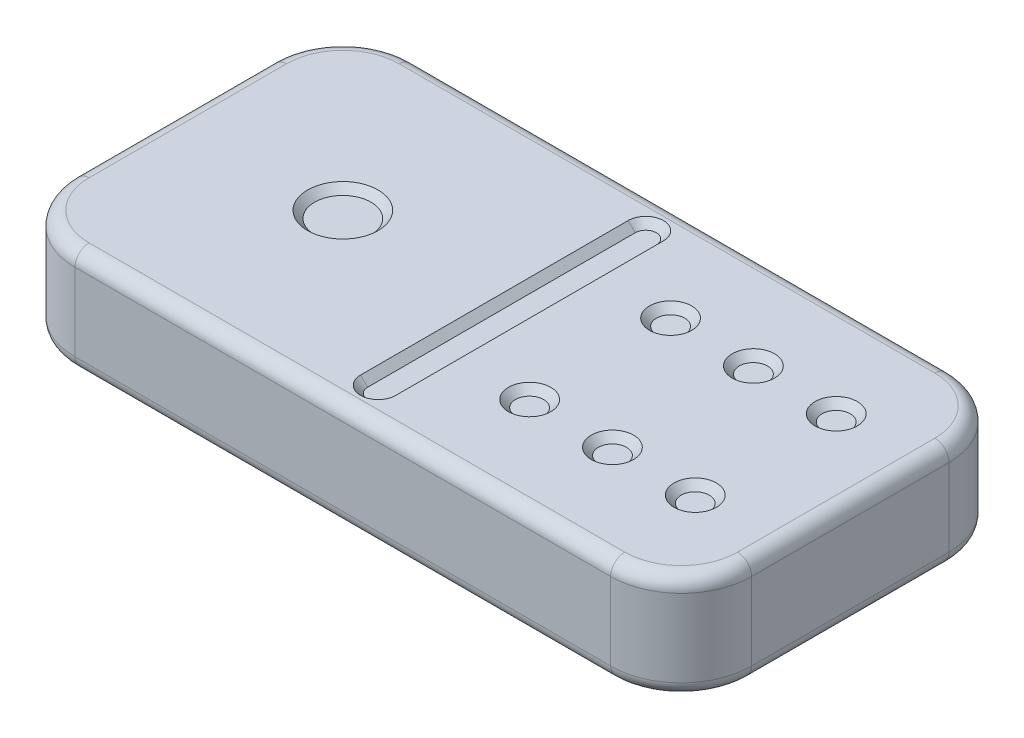
ISO-10303-21;
HEADER;
FILE_DESCRIPTION(('STEP AP214'),'2;1');
FILE_NAME('part.step','',(''),(''),'','','');
FILE_SCHEMA(('AUTOMOTIVE_DESIGN { 1 0 10303 214 1 1 1 1 }'));
ENDSEC;
DATA;
#1=APPLICATION_CONTEXT('core data for automotive mechanical design processes');
#2=APPLICATION_PROTOCOL_DEFINITION('international standard','automotive_design',2000,#1);
#3=PRODUCT_CONTEXT('',#1,'mechanical');
#4=PRODUCT('Part','Part','',(#3));
#5=PRODUCT_RELATED_PRODUCT_CATEGORY('part','',(#4));
#6=PRODUCT_DEFINITION_FORMATION('','',#4);
#7=PRODUCT_DEFINITION_CONTEXT('part definition',#1,'design');
#8=PRODUCT_DEFINITION('design','',#6,#7);
#9=PRODUCT_DEFINITION_SHAPE('','',#8);
#10=(LENGTH_UNIT() NAMED_UNIT(*) SI_UNIT(.MILLI.,.METRE.));
#11=(NAMED_UNIT(*) PLANE_ANGLE_UNIT() SI_UNIT($,.RADIAN.));
#12=(NAMED_UNIT(*) SI_UNIT($,.STERADIAN.) SOLID_ANGLE_UNIT());
#13=UNCERTAINTY_MEASURE_WITH_UNIT(LENGTH_MEASURE(1.E-05),#10,'distance_accuracy_value','');
#14=(GEOMETRIC_REPRESENTATION_CONTEXT(3) GLOBAL_UNCERTAINTY_ASSIGNED_CONTEXT((#13)) GLOBAL_UNIT_ASSIGNED_CONTEXT((#10,
#11,#12)) REPRESENTATION_CONTEXT('',''));
#15=CARTESIAN_POINT('',(0.,0.,0.));
#16=DIRECTION('',(0.,0.,1.));
#17=DIRECTION('',(1.,0.,0.));
#18=AXIS2_PLACEMENT_3D('',#15,#16,#17);
#19=CARTESIAN_POINT('',(0.,7.5,0.));
#20=DIRECTION('',(1.,0.,0.));
#21=DIRECTION('',(0.,0.,-1.));
#22=AXIS2_PLACEMENT_3D('',#19,#20,#21);
#23=PLANE('',#22);
#24=DIRECTION('',(0.,-1.,0.));
#25=VECTOR('',#24,1.);
#26=CARTESIAN_POINT('',(0.,7.5,-19.));
#27=LINE('',#26,#25);
#28=CARTESIAN_POINT('',(0.,6.5,-19.));
#29=VERTEX_POINT('',#28);
#30=CARTESIAN_POINT('',(0.,1.,-19.));
#31=VERTEX_POINT('',#30);
#32=EDGE_CURVE('E882',#29,#31,#27,.T.);
#33=ORIENTED_EDGE('',*,*,#32,.T.);
#34=DIRECTION('',(0.,0.,1.));
#35=VECTOR('',#34,1.);
#36=CARTESIAN_POINT('',(0.,1.,-5.));
#37=LINE('',#36,#35);
#38=CARTESIAN_POINT('',(0.,1.,-5.));
#39=VERTEX_POINT('',#38);
#40=EDGE_CURVE('E300',#31,#39,#37,.T.);
#41=ORIENTED_EDGE('',*,*,#40,.T.);
#42=DIRECTION('',(0.,-1.,0.));
#43=VECTOR('',#42,1.);
#44=CARTESIAN_POINT('',(0.,7.5,-5.));
#45=LINE('',#44,#43);
#46=CARTESIAN_POINT('',(0.,6.5,-5.));
#47=VERTEX_POINT('',#46);
#48=EDGE_CURVE('E195',#39,#47,#45,.F.);
#49=ORIENTED_EDGE('',*,*,#48,.T.);
#50=DIRECTION('',(0.,0.,1.));
#51=VECTOR('',#50,1.);
#52=CARTESIAN_POINT('',(0.,6.5,0.));
#53=LINE('',#52,#51);
#54=EDGE_CURVE('E224',#47,#29,#53,.F.);
#55=ORIENTED_EDGE('',*,*,#54,.T.);
#56=EDGE_LOOP('',(#33,#41,#49,#55));
#57=FACE_BOUND('',#56,.T.);
#58=ADVANCED_FACE('F37',(#57),#23,.F.);
#59=CARTESIAN_POINT('',(0.,7.5,0.));
#60=DIRECTION('',(0.,0.,-1.));
#61=DIRECTION('',(-1.,0.,0.));
#62=AXIS2_PLACEMENT_3D('',#59,#60,#61);
#63=PLANE('',#62);
#64=DIRECTION('',(0.,-1.,0.));
#65=VECTOR('',#64,1.);
#66=CARTESIAN_POINT('',(5.,7.5,0.));
#67=LINE('',#66,#65);
#68=CARTESIAN_POINT('',(5.,6.5,0.));
#69=VERTEX_POINT('',#68);
#70=CARTESIAN_POINT('',(5.,1.,0.));
#71=VERTEX_POINT('',#70);
#72=EDGE_CURVE('E868',#69,#71,#67,.T.);
#73=ORIENTED_EDGE('',*,*,#72,.T.);
#74=DIRECTION('',(1.,0.,0.));
#75=VECTOR('',#74,1.);
#76=CARTESIAN_POINT('',(43.,1.,0.));
#77=LINE('',#76,#75);
#78=CARTESIAN_POINT('',(43.,1.,0.));
#79=VERTEX_POINT('',#78);
#80=EDGE_CURVE('E294',#71,#79,#77,.T.);
#81=ORIENTED_EDGE('',*,*,#80,.T.);
#82=DIRECTION('',(0.,-1.,0.));
#83=VECTOR('',#82,1.);
#84=CARTESIAN_POINT('',(43.,7.5,0.));
#85=LINE('',#84,#83);
#86=CARTESIAN_POINT('',(43.,6.5,0.));
#87=VERTEX_POINT('',#86);
#88=EDGE_CURVE('E872',#79,#87,#85,.F.);
#89=ORIENTED_EDGE('',*,*,#88,.T.);
#90=DIRECTION('',(1.,0.,0.));
#91=VECTOR('',#90,1.);
#92=CARTESIAN_POINT('',(0.,6.5,0.));
#93=LINE('',#92,#91);
#94=EDGE_CURVE('E217',#87,#69,#93,.F.);
#95=ORIENTED_EDGE('',*,*,#94,.T.);
#96=EDGE_LOOP('',(#73,#81,#89,#95));
#97=FACE_BOUND('',#96,.T.);
#98=ADVANCED_FACE('F403',(#97),#63,.F.);
#99=CARTESIAN_POINT('',(48.,7.5,0.));
#100=DIRECTION('',(-1.,0.,0.));
#101=DIRECTION('',(0.,0.,1.));
#102=AXIS2_PLACEMENT_3D('',#99,#100,#101);
#103=PLANE('',#102);
#104=DIRECTION('',(0.,-1.,0.));
#105=VECTOR('',#104,1.);
#106=CARTESIAN_POINT('',(48.,7.5,-5.));
#107=LINE('',#106,#105);
#108=CARTESIAN_POINT('',(48.,6.5,-5.));
#109=VERTEX_POINT('',#108);
#110=CARTESIAN_POINT('',(48.,1.,-5.));
#111=VERTEX_POINT('',#110);
#112=EDGE_CURVE('E865',#109,#111,#107,.T.);
#113=ORIENTED_EDGE('',*,*,#112,.T.);
#114=DIRECTION('',(0.,0.,-1.));
#115=VECTOR('',#114,1.);
#116=CARTESIAN_POINT('',(48.,1.,-19.));
#117=LINE('',#116,#115);
#118=CARTESIAN_POINT('',(48.,1.,-19.));
#119=VERTEX_POINT('',#118);
#120=EDGE_CURVE('E288',#111,#119,#117,.T.);
#121=ORIENTED_EDGE('',*,*,#120,.T.);
#122=DIRECTION('',(0.,-1.,0.));
#123=VECTOR('',#122,1.);
#124=CARTESIAN_POINT('',(48.,7.5,-19.));
#125=LINE('',#124,#123);
#126=CARTESIAN_POINT('',(48.,6.5,-19.));
#127=VERTEX_POINT('',#126);
#128=EDGE_CURVE('E259',#119,#127,#125,.F.);
#129=ORIENTED_EDGE('',*,*,#128,.T.);
#130=DIRECTION('',(0.,0.,-1.));
#131=VECTOR('',#130,1.);
#132=CARTESIAN_POINT('',(48.,6.5,0.));
#133=LINE('',#132,#131);
#134=EDGE_CURVE('E205',#127,#109,#133,.F.);
#135=ORIENTED_EDGE('',*,*,#134,.T.);
#136=EDGE_LOOP('',(#113,#121,#129,#135));
#137=FACE_BOUND('',#136,.T.);
#138=ADVANCED_FACE('F409',(#137),#103,.F.);
#139=CARTESIAN_POINT('',(0.,7.5,-24.));
#140=DIRECTION('',(0.,0.,1.));
#141=DIRECTION('',(1.,0.,0.));
#142=AXIS2_PLACEMENT_3D('',#139,#140,#141);
#143=PLANE('',#142);
#144=DIRECTION('',(0.,-1.,0.));
#145=VECTOR('',#144,1.);
#146=CARTESIAN_POINT('',(43.,7.5,-24.));
#147=LINE('',#146,#145);
#148=CARTESIAN_POINT('',(43.,6.5,-24.));
#149=VERTEX_POINT('',#148);
#150=CARTESIAN_POINT('',(43.,1.,-24.));
#151=VERTEX_POINT('',#150);
#152=EDGE_CURVE('E878',#149,#151,#147,.T.);
#153=ORIENTED_EDGE('',*,*,#152,.T.);
#154=DIRECTION('',(-1.,0.,0.));
#155=VECTOR('',#154,1.);
#156=CARTESIAN_POINT('',(4.99999999999999,1.,-24.));
#157=LINE('',#156,#155);
#158=CARTESIAN_POINT('',(4.99999999999999,1.,-24.));
#159=VERTEX_POINT('',#158);
#160=EDGE_CURVE('E306',#151,#159,#157,.T.);
#161=ORIENTED_EDGE('',*,*,#160,.T.);
#162=DIRECTION('',(0.,-1.,0.));
#163=VECTOR('',#162,1.);
#164=CARTESIAN_POINT('',(4.99999999999999,7.5,-24.));
#165=LINE('',#164,#163);
#166=CARTESIAN_POINT('',(4.99999999999999,6.5,-24.));
#167=VERTEX_POINT('',#166);
#168=EDGE_CURVE('E875',#159,#167,#165,.F.);
#169=ORIENTED_EDGE('',*,*,#168,.T.);
#170=DIRECTION('',(-1.,0.,0.));
#171=VECTOR('',#170,1.);
#172=CARTESIAN_POINT('',(0.,6.5,-24.));
#173=LINE('',#172,#171);
#174=EDGE_CURVE('E231',#167,#149,#173,.F.);
#175=ORIENTED_EDGE('',*,*,#174,.T.);
#176=EDGE_LOOP('',(#153,#161,#169,#175));
#177=FACE_BOUND('',#176,.T.);
#178=ADVANCED_FACE('F748',(#177),#143,.F.);
#179=CARTESIAN_POINT('',(0.,7.5,-24.));
#180=DIRECTION('',(0.,-1.,0.));
#181=DIRECTION('',(0.,0.,-1.));
#182=AXIS2_PLACEMENT_3D('',#179,#180,#181);
#183=PLANE('',#182);
#184=CARTESIAN_POINT('',(42.,7.5,-7.));
#185=DIRECTION('',(0.,1.,0.));
#186=DIRECTION('',(0.,0.,1.));
#187=AXIS2_PLACEMENT_3D('',#184,#185,#186);
#188=CIRCLE('',#187,1.5);
#189=CARTESIAN_POINT('',(42.,7.5,-5.5));
#190=VERTEX_POINT('',#189);
#191=EDGE_CURVE('E827',#190,#190,#188,.T.);
#192=ORIENTED_EDGE('',*,*,#191,.F.);
#193=EDGE_LOOP('',(#192));
#194=FACE_BOUND('',#193,.T.);
#195=CARTESIAN_POINT('',(36.125,7.5,-7.));
#196=DIRECTION('',(0.,1.,0.));
#197=DIRECTION('',(0.,0.,1.));
#198=AXIS2_PLACEMENT_3D('',#195,#196,#197);
#199=CIRCLE('',#198,1.5);
#200=CARTESIAN_POINT('',(36.125,7.5,-5.5));
#201=VERTEX_POINT('',#200);
#202=EDGE_CURVE('E831',#201,#201,#199,.T.);
#203=ORIENTED_EDGE('',*,*,#202,.F.);
#204=EDGE_LOOP('',(#203));
#205=FACE_BOUND('',#204,.T.);
#206=CARTESIAN_POINT('',(30.25,7.5,-7.));
#207=DIRECTION('',(0.,1.,0.));
#208=DIRECTION('',(0.,0.,1.));
#209=AXIS2_PLACEMENT_3D('',#206,#207,#208);
#210=CIRCLE('',#209,1.5);
#211=CARTESIAN_POINT('',(30.25,7.5,-5.5));
#212=VERTEX_POINT('',#211);
#213=EDGE_CURVE('E835',#212,#212,#210,.T.);
#214=ORIENTED_EDGE('',*,*,#213,.F.);
#215=EDGE_LOOP('',(#214));
#216=FACE_BOUND('',#215,.T.);
#217=CARTESIAN_POINT('',(42.,7.5,-17.));
#218=DIRECTION('',(0.,1.,0.));
#219=DIRECTION('',(0.,0.,1.));
#220=AXIS2_PLACEMENT_3D('',#217,#218,#219);
#221=CIRCLE('',#220,1.5);
#222=CARTESIAN_POINT('',(42.,7.5,-15.5));
#223=VERTEX_POINT('',#222);
#224=EDGE_CURVE('E839',#223,#223,#221,.T.);
#225=ORIENTED_EDGE('',*,*,#224,.F.);
#226=EDGE_LOOP('',(#225));
#227=FACE_BOUND('',#226,.T.);
#228=CARTESIAN_POINT('',(36.125,7.5,-17.));
#229=DIRECTION('',(0.,1.,0.));
#230=DIRECTION('',(0.,0.,1.));
#231=AXIS2_PLACEMENT_3D('',#228,#229,#230);
#232=CIRCLE('',#231,1.5);
#233=CARTESIAN_POINT('',(36.125,7.5,-15.5));
#234=VERTEX_POINT('',#233);
#235=EDGE_CURVE('E843',#234,#234,#232,.T.);
#236=ORIENTED_EDGE('',*,*,#235,.F.);
#237=EDGE_LOOP('',(#236));
#238=FACE_BOUND('',#237,.T.);
#239=CARTESIAN_POINT('',(30.25,7.5,-17.));
#240=DIRECTION('',(0.,1.,0.));
#241=DIRECTION('',(0.,0.,1.));
#242=AXIS2_PLACEMENT_3D('',#239,#240,#241);
#243=CIRCLE('',#242,1.5);
#244=CARTESIAN_POINT('',(30.25,7.5,-15.5));
#245=VERTEX_POINT('',#244);
#246=EDGE_CURVE('E847',#245,#245,#243,.T.);
#247=ORIENTED_EDGE('',*,*,#246,.F.);
#248=EDGE_LOOP('',(#247));
#249=FACE_BOUND('',#248,.T.);
#250=CARTESIAN_POINT('',(12.,7.5,-12.));
#251=DIRECTION('',(0.,1.,0.));
#252=DIRECTION('',(0.,0.,1.));
#253=AXIS2_PLACEMENT_3D('',#250,#251,#252);
#254=CIRCLE('',#253,2.5);
#255=CARTESIAN_POINT('',(12.,7.5,-9.5));
#256=VERTEX_POINT('',#255);
#257=EDGE_CURVE('E850',#256,#256,#254,.T.);
#258=ORIENTED_EDGE('',*,*,#257,.F.);
#259=EDGE_LOOP('',(#258));
#260=FACE_BOUND('',#259,.T.);
#261=DIRECTION('',(0.,0.,-1.));
#262=VECTOR('',#261,1.);
#263=CARTESIAN_POINT('',(22.75,7.5,-24.));
#264=LINE('',#263,#262);
#265=CARTESIAN_POINT('',(22.75,7.5,-2.5085750787772));
#266=VERTEX_POINT('',#265);
#267=CARTESIAN_POINT('',(22.75,7.5,-21.4914249212228));
#268=VERTEX_POINT('',#267);
#269=EDGE_CURVE('E309',#266,#268,#264,.T.);
#270=ORIENTED_EDGE('',*,*,#269,.T.);
#271=CARTESIAN_POINT('',(24.,7.5,-21.4914249212228));
#272=DIRECTION('',(0.,-1.,0.));
#273=DIRECTION('',(0.,0.,-1.));
#274=AXIS2_PLACEMENT_3D('',#271,#272,#273);
#275=CIRCLE('',#274,1.25000000000001);
#276=CARTESIAN_POINT('',(25.25,7.5,-21.4914249212228));
#277=VERTEX_POINT('',#276);
#278=EDGE_CURVE('E347',#268,#277,#275,.T.);
#279=ORIENTED_EDGE('',*,*,#278,.T.);
#280=DIRECTION('',(0.,0.,1.));
#281=VECTOR('',#280,1.);
#282=CARTESIAN_POINT('',(25.25,7.5,-24.));
#283=LINE('',#282,#281);
#284=CARTESIAN_POINT('',(25.25,7.5,-2.5085750787772));
#285=VERTEX_POINT('',#284);
#286=EDGE_CURVE('E344',#277,#285,#283,.T.);
#287=ORIENTED_EDGE('',*,*,#286,.T.);
#288=CARTESIAN_POINT('',(24.,7.5,-2.5085750787772));
#289=DIRECTION('',(0.,-1.,0.));
#290=DIRECTION('',(0.,0.,-1.));
#291=AXIS2_PLACEMENT_3D('',#288,#289,#290);
#292=CIRCLE('',#291,1.25000000000001);
#293=EDGE_CURVE('E341',#285,#266,#292,.T.);
#294=ORIENTED_EDGE('',*,*,#293,.T.);
#295=EDGE_LOOP('',(#270,#279,#287,#294));
#296=FACE_BOUND('',#295,.T.);
#297=DIRECTION('',(0.,0.,-1.));
#298=VECTOR('',#297,1.);
#299=CARTESIAN_POINT('',(47.,7.5,-24.));
#300=LINE('',#299,#298);
#301=CARTESIAN_POINT('',(47.,7.5,-5.));
#302=VERTEX_POINT('',#301);
#303=CARTESIAN_POINT('',(47.,7.5,-19.));
#304=VERTEX_POINT('',#303);
#305=EDGE_CURVE('E199',#302,#304,#300,.T.);
#306=ORIENTED_EDGE('',*,*,#305,.T.);
#307=CARTESIAN_POINT('',(43.,7.5,-19.));
#308=DIRECTION('',(0.,-1.,0.));
#309=DIRECTION('',(0.,0.,-1.));
#310=AXIS2_PLACEMENT_3D('',#307,#308,#309);
#311=CIRCLE('',#310,4.);
#312=CARTESIAN_POINT('',(43.,7.5,-23.));
#313=VERTEX_POINT('',#312);
#314=EDGE_CURVE('E177',#304,#313,#311,.F.);
#315=ORIENTED_EDGE('',*,*,#314,.T.);
#316=DIRECTION('',(-1.,0.,0.));
#317=VECTOR('',#316,1.);
#318=CARTESIAN_POINT('',(0.,7.5,-23.));
#319=LINE('',#318,#317);
#320=CARTESIAN_POINT('',(4.99999999999999,7.5,-23.));
#321=VERTEX_POINT('',#320);
#322=EDGE_CURVE('E187',#313,#321,#319,.T.);
#323=ORIENTED_EDGE('',*,*,#322,.T.);
#324=CARTESIAN_POINT('',(4.99999999999999,7.5,-19.));
#325=DIRECTION('',(0.,-1.,0.));
#326=DIRECTION('',(0.,0.,-1.));
#327=AXIS2_PLACEMENT_3D('',#324,#325,#326);
#328=CIRCLE('',#327,4.);
#329=CARTESIAN_POINT('',(0.999999999999989,7.5,-19.));
#330=VERTEX_POINT('',#329);
#331=EDGE_CURVE('E194',#321,#330,#328,.F.);
#332=ORIENTED_EDGE('',*,*,#331,.T.);
#333=DIRECTION('',(0.,0.,1.));
#334=VECTOR('',#333,1.);
#335=CARTESIAN_POINT('',(0.999999999999986,7.5,-24.));
#336=LINE('',#335,#334);
#337=CARTESIAN_POINT('',(0.999999999999997,7.5,-5.));
#338=VERTEX_POINT('',#337);
#339=EDGE_CURVE('E889',#330,#338,#336,.T.);
#340=ORIENTED_EDGE('',*,*,#339,.T.);
#341=CARTESIAN_POINT('',(5.,7.5,-5.));
#342=DIRECTION('',(0.,-1.,0.));
#343=DIRECTION('',(0.,0.,-1.));
#344=AXIS2_PLACEMENT_3D('',#341,#342,#343);
#345=CIRCLE('',#344,4.);
#346=CARTESIAN_POINT('',(5.,7.5,-1.));
#347=VERTEX_POINT('',#346);
#348=EDGE_CURVE('E892',#338,#347,#345,.F.);
#349=ORIENTED_EDGE('',*,*,#348,.T.);
#350=DIRECTION('',(1.,0.,0.));
#351=VECTOR('',#350,1.);
#352=CARTESIAN_POINT('',(0.,7.5,-1.));
#353=LINE('',#352,#351);
#354=CARTESIAN_POINT('',(43.,7.5,-1.));
#355=VERTEX_POINT('',#354);
#356=EDGE_CURVE('E895',#347,#355,#353,.T.);
#357=ORIENTED_EDGE('',*,*,#356,.T.);
#358=CARTESIAN_POINT('',(43.,7.5,-5.));
#359=DIRECTION('',(0.,-1.,0.));
#360=DIRECTION('',(0.,0.,-1.));
#361=AXIS2_PLACEMENT_3D('',#358,#359,#360);
#362=CIRCLE('',#361,4.);
#363=EDGE_CURVE('E207',#355,#302,#362,.F.);
#364=ORIENTED_EDGE('',*,*,#363,.T.);
#365=EDGE_LOOP('',(#306,#315,#323,#332,#340,#349,#357,#364));
#366=FACE_BOUND('',#365,.T.);
#367=ADVANCED_FACE('F197',(#194,#205,#216,#227,#238,#249,#260,#296,#366),#183,.F.);
#368=CARTESIAN_POINT('',(0.,0.,-24.));
#369=DIRECTION('',(0.,-1.,0.));
#370=DIRECTION('',(0.,0.,-1.));
#371=AXIS2_PLACEMENT_3D('',#368,#369,#370);
#372=PLANE('',#371);
#373=DIRECTION('',(-1.,0.,0.));
#374=VECTOR('',#373,1.);
#375=CARTESIAN_POINT('',(43.,0.,-23.));
#376=LINE('',#375,#374);
#377=CARTESIAN_POINT('',(4.99999999999999,0.,-23.));
#378=VERTEX_POINT('',#377);
#379=CARTESIAN_POINT('',(43.,0.,-23.));
#380=VERTEX_POINT('',#379);
#381=EDGE_CURVE('E233',#378,#380,#376,.F.);
#382=ORIENTED_EDGE('',*,*,#381,.T.);
#383=CARTESIAN_POINT('',(43.,0.,-19.));
#384=DIRECTION('',(0.,-1.,0.));
#385=DIRECTION('',(0.,0.,-1.));
#386=AXIS2_PLACEMENT_3D('',#383,#384,#385);
#387=CIRCLE('',#386,4.);
#388=CARTESIAN_POINT('',(47.,0.,-19.));
#389=VERTEX_POINT('',#388);
#390=EDGE_CURVE('E280',#380,#389,#387,.T.);
#391=ORIENTED_EDGE('',*,*,#390,.T.);
#392=DIRECTION('',(0.,0.,-1.));
#393=VECTOR('',#392,1.);
#394=CARTESIAN_POINT('',(47.,0.,-5.));
#395=LINE('',#394,#393);
#396=CARTESIAN_POINT('',(47.,0.,-5.));
#397=VERTEX_POINT('',#396);
#398=EDGE_CURVE('E277',#389,#397,#395,.F.);
#399=ORIENTED_EDGE('',*,*,#398,.T.);
#400=CARTESIAN_POINT('',(43.,0.,-5.));
#401=DIRECTION('',(0.,-1.,0.));
#402=DIRECTION('',(0.,0.,-1.));
#403=AXIS2_PLACEMENT_3D('',#400,#401,#402);
#404=CIRCLE('',#403,4.);
#405=CARTESIAN_POINT('',(43.,0.,-1.));
#406=VERTEX_POINT('',#405);
#407=EDGE_CURVE('E274',#397,#406,#404,.T.);
#408=ORIENTED_EDGE('',*,*,#407,.T.);
#409=DIRECTION('',(1.,0.,0.));
#410=VECTOR('',#409,1.);
#411=CARTESIAN_POINT('',(5.,0.,-1.));
#412=LINE('',#411,#410);
#413=CARTESIAN_POINT('',(5.,0.,-1.));
#414=VERTEX_POINT('',#413);
#415=EDGE_CURVE('E271',#406,#414,#412,.F.);
#416=ORIENTED_EDGE('',*,*,#415,.T.);
#417=CARTESIAN_POINT('',(5.,0.,-5.));
#418=DIRECTION('',(0.,-1.,0.));
#419=DIRECTION('',(0.,0.,-1.));
#420=AXIS2_PLACEMENT_3D('',#417,#418,#419);
#421=CIRCLE('',#420,4.);
#422=CARTESIAN_POINT('',(0.999999999999997,0.,-5.));
#423=VERTEX_POINT('',#422);
#424=EDGE_CURVE('E268',#414,#423,#421,.T.);
#425=ORIENTED_EDGE('',*,*,#424,.T.);
#426=DIRECTION('',(0.,0.,1.));
#427=VECTOR('',#426,1.);
#428=CARTESIAN_POINT('',(0.999999999999989,0.,-19.));
#429=LINE('',#428,#427);
#430=CARTESIAN_POINT('',(0.999999999999989,0.,-19.));
#431=VERTEX_POINT('',#430);
#432=EDGE_CURVE('E265',#423,#431,#429,.F.);
#433=ORIENTED_EDGE('',*,*,#432,.T.);
#434=CARTESIAN_POINT('',(4.99999999999999,0.,-19.));
#435=DIRECTION('',(0.,-1.,0.));
#436=DIRECTION('',(0.,0.,-1.));
#437=AXIS2_PLACEMENT_3D('',#434,#435,#436);
#438=CIRCLE('',#437,4.);
#439=EDGE_CURVE('E262',#431,#378,#438,.T.);
#440=ORIENTED_EDGE('',*,*,#439,.T.);
#441=EDGE_LOOP('',(#382,#391,#399,#408,#416,#425,#433,#440));
#442=FACE_BOUND('',#441,.T.);
#443=ADVANCED_FACE('F419',(#442),#372,.T.);
#444=CARTESIAN_POINT('',(43.,7.5,-5.));
#445=DIRECTION('',(0.,-1.,0.));
#446=DIRECTION('',(0.,0.,-1.));
#447=AXIS2_PLACEMENT_3D('',#444,#445,#446);
#448=CYLINDRICAL_SURFACE('',#447,5.);
#449=ORIENTED_EDGE('',*,*,#88,.F.);
#450=CARTESIAN_POINT('',(43.,1.,-5.));
#451=DIRECTION('',(0.,-1.,0.));
#452=DIRECTION('',(0.,0.,-1.));
#453=AXIS2_PLACEMENT_3D('',#450,#451,#452);
#454=CIRCLE('',#453,5.);
#455=EDGE_CURVE('E291',#79,#111,#454,.F.);
#456=ORIENTED_EDGE('',*,*,#455,.T.);
#457=ORIENTED_EDGE('',*,*,#112,.F.);
#458=CARTESIAN_POINT('',(43.,6.5,-5.));
#459=DIRECTION('',(0.,-1.,0.));
#460=DIRECTION('',(0.,0.,-1.));
#461=AXIS2_PLACEMENT_3D('',#458,#459,#460);
#462=CIRCLE('',#461,5.);
#463=EDGE_CURVE('E213',#109,#87,#462,.T.);
#464=ORIENTED_EDGE('',*,*,#463,.T.);
#465=EDGE_LOOP('',(#449,#456,#457,#464));
#466=FACE_BOUND('',#465,.T.);
#467=ADVANCED_FACE('F415',(#466),#448,.T.);
#468=CARTESIAN_POINT('',(43.,7.5,-19.));
#469=DIRECTION('',(0.,-1.,0.));
#470=DIRECTION('',(0.,0.,-1.));
#471=AXIS2_PLACEMENT_3D('',#468,#469,#470);
#472=CYLINDRICAL_SURFACE('',#471,5.);
#473=ORIENTED_EDGE('',*,*,#128,.F.);
#474=CARTESIAN_POINT('',(43.,1.,-19.));
#475=DIRECTION('',(0.,-1.,0.));
#476=DIRECTION('',(0.,0.,-1.));
#477=AXIS2_PLACEMENT_3D('',#474,#475,#476);
#478=CIRCLE('',#477,5.);
#479=EDGE_CURVE('E284',#119,#151,#478,.F.);
#480=ORIENTED_EDGE('',*,*,#479,.T.);
#481=ORIENTED_EDGE('',*,*,#152,.F.);
#482=CARTESIAN_POINT('',(43.,6.5,-19.));
#483=DIRECTION('',(0.,-1.,0.));
#484=DIRECTION('',(0.,0.,-1.));
#485=AXIS2_PLACEMENT_3D('',#482,#483,#484);
#486=CIRCLE('',#485,5.);
#487=EDGE_CURVE('E179',#149,#127,#486,.T.);
#488=ORIENTED_EDGE('',*,*,#487,.T.);
#489=EDGE_LOOP('',(#473,#480,#481,#488));
#490=FACE_BOUND('',#489,.T.);
#491=ADVANCED_FACE('F418',(#490),#472,.T.);
#492=CARTESIAN_POINT('',(5.,7.5,-5.));
#493=DIRECTION('',(0.,-1.,0.));
#494=DIRECTION('',(0.,0.,-1.));
#495=AXIS2_PLACEMENT_3D('',#492,#493,#494);
#496=CYLINDRICAL_SURFACE('',#495,5.);
#497=ORIENTED_EDGE('',*,*,#48,.F.);
#498=CARTESIAN_POINT('',(5.,1.,-5.));
#499=DIRECTION('',(0.,-1.,0.));
#500=DIRECTION('',(0.,0.,-1.));
#501=AXIS2_PLACEMENT_3D('',#498,#499,#500);
#502=CIRCLE('',#501,5.);
#503=EDGE_CURVE('E297',#39,#71,#502,.F.);
#504=ORIENTED_EDGE('',*,*,#503,.T.);
#505=ORIENTED_EDGE('',*,*,#72,.F.);
#506=CARTESIAN_POINT('',(5.,6.5,-5.));
#507=DIRECTION('',(0.,-1.,0.));
#508=DIRECTION('',(0.,0.,-1.));
#509=AXIS2_PLACEMENT_3D('',#506,#507,#508);
#510=CIRCLE('',#509,5.);
#511=EDGE_CURVE('E220',#69,#47,#510,.T.);
#512=ORIENTED_EDGE('',*,*,#511,.T.);
#513=EDGE_LOOP('',(#497,#504,#505,#512));
#514=FACE_BOUND('',#513,.T.);
#515=ADVANCED_FACE('F423',(#514),#496,.T.);
#516=CARTESIAN_POINT('',(4.99999999999999,7.5,-19.));
#517=DIRECTION('',(0.,-1.,0.));
#518=DIRECTION('',(0.,0.,-1.));
#519=AXIS2_PLACEMENT_3D('',#516,#517,#518);
#520=CYLINDRICAL_SURFACE('',#519,5.);
#521=ORIENTED_EDGE('',*,*,#168,.F.);
#522=CARTESIAN_POINT('',(4.99999999999999,1.,-19.));
#523=DIRECTION('',(0.,-1.,0.));
#524=DIRECTION('',(0.,0.,-1.));
#525=AXIS2_PLACEMENT_3D('',#522,#523,#524);
#526=CIRCLE('',#525,5.);
#527=EDGE_CURVE('E303',#159,#31,#526,.F.);
#528=ORIENTED_EDGE('',*,*,#527,.T.);
#529=ORIENTED_EDGE('',*,*,#32,.F.);
#530=CARTESIAN_POINT('',(4.99999999999999,6.5,-19.));
#531=DIRECTION('',(0.,-1.,0.));
#532=DIRECTION('',(0.,0.,-1.));
#533=AXIS2_PLACEMENT_3D('',#530,#531,#532);
#534=CIRCLE('',#533,5.);
#535=EDGE_CURVE('E227',#29,#167,#534,.T.);
#536=ORIENTED_EDGE('',*,*,#535,.T.);
#537=EDGE_LOOP('',(#521,#528,#529,#536));
#538=FACE_BOUND('',#537,.T.);
#539=ADVANCED_FACE('F427',(#538),#520,.T.);
#540=CARTESIAN_POINT('',(5.,6.5,-5.));
#541=DIRECTION('',(0.,-1.,0.));
#542=DIRECTION('',(0.,0.,-1.));
#543=AXIS2_PLACEMENT_3D('',#540,#541,#542);
#544=TOROIDAL_SURFACE('',#543,4.,1.);
#545=CARTESIAN_POINT('',(0.999999999999997,6.5,-5.));
#546=DIRECTION('',(0.,0.,-1.));
#547=DIRECTION('',(-1.,0.,0.));
#548=AXIS2_PLACEMENT_3D('',#545,#546,#547);
#549=CIRCLE('',#548,1.);
#550=EDGE_CURVE('E251',#47,#338,#549,.T.);
#551=ORIENTED_EDGE('',*,*,#550,.F.);
#552=ORIENTED_EDGE('',*,*,#511,.F.);
#553=CARTESIAN_POINT('',(5.,6.5,-1.));
#554=DIRECTION('',(1.,0.,0.));
#555=DIRECTION('',(0.,0.,-1.));
#556=AXIS2_PLACEMENT_3D('',#553,#554,#555);
#557=CIRCLE('',#556,1.);
#558=EDGE_CURVE('E255',#347,#69,#557,.T.);
#559=ORIENTED_EDGE('',*,*,#558,.F.);
#560=ORIENTED_EDGE('',*,*,#348,.F.);
#561=EDGE_LOOP('',(#551,#552,#559,#560));
#562=FACE_BOUND('',#561,.T.);
#563=ADVANCED_FACE('F431',(#562),#544,.T.);
#564=CARTESIAN_POINT('',(0.,6.5,-1.));
#565=DIRECTION('',(1.,0.,0.));
#566=DIRECTION('',(0.,0.,-1.));
#567=AXIS2_PLACEMENT_3D('',#564,#565,#566);
#568=CYLINDRICAL_SURFACE('',#567,1.);
#569=ORIENTED_EDGE('',*,*,#558,.T.);
#570=ORIENTED_EDGE('',*,*,#94,.F.);
#571=CARTESIAN_POINT('',(43.,6.5,-1.));
#572=DIRECTION('',(1.,0.,0.));
#573=DIRECTION('',(0.,0.,-1.));
#574=AXIS2_PLACEMENT_3D('',#571,#572,#573);
#575=CIRCLE('',#574,1.);
#576=EDGE_CURVE('E247',#355,#87,#575,.T.);
#577=ORIENTED_EDGE('',*,*,#576,.F.);
#578=ORIENTED_EDGE('',*,*,#356,.F.);
#579=EDGE_LOOP('',(#569,#570,#577,#578));
#580=FACE_BOUND('',#579,.T.);
#581=ADVANCED_FACE('F453',(#580),#568,.T.);
#582=CARTESIAN_POINT('',(0.999999999999986,6.5,-24.));
#583=DIRECTION('',(0.,0.,1.));
#584=DIRECTION('',(1.,0.,0.));
#585=AXIS2_PLACEMENT_3D('',#582,#583,#584);
#586=CYLINDRICAL_SURFACE('',#585,1.);
#587=ORIENTED_EDGE('',*,*,#550,.T.);
#588=ORIENTED_EDGE('',*,*,#339,.F.);
#589=CARTESIAN_POINT('',(0.999999999999989,6.5,-19.));
#590=DIRECTION('',(0.,0.,-1.));
#591=DIRECTION('',(-1.,0.,0.));
#592=AXIS2_PLACEMENT_3D('',#589,#590,#591);
#593=CIRCLE('',#592,1.);
#594=EDGE_CURVE('E243',#29,#330,#593,.T.);
#595=ORIENTED_EDGE('',*,*,#594,.F.);
#596=ORIENTED_EDGE('',*,*,#54,.F.);
#597=EDGE_LOOP('',(#587,#588,#595,#596));
#598=FACE_BOUND('',#597,.T.);
#599=ADVANCED_FACE('F449',(#598),#586,.T.);
#600=CARTESIAN_POINT('',(43.,6.5,-5.));
#601=DIRECTION('',(0.,-1.,0.));
#602=DIRECTION('',(0.,0.,-1.));
#603=AXIS2_PLACEMENT_3D('',#600,#601,#602);
#604=TOROIDAL_SURFACE('',#603,4.,1.);
#605=ORIENTED_EDGE('',*,*,#576,.T.);
#606=ORIENTED_EDGE('',*,*,#463,.F.);
#607=CARTESIAN_POINT('',(47.,6.5,-5.));
#608=DIRECTION('',(0.,0.,-1.));
#609=DIRECTION('',(-1.,0.,0.));
#610=AXIS2_PLACEMENT_3D('',#607,#608,#609);
#611=CIRCLE('',#610,1.);
#612=EDGE_CURVE('E239',#302,#109,#611,.T.);
#613=ORIENTED_EDGE('',*,*,#612,.F.);
#614=ORIENTED_EDGE('',*,*,#363,.F.);
#615=EDGE_LOOP('',(#605,#606,#613,#614));
#616=FACE_BOUND('',#615,.T.);
#617=ADVANCED_FACE('F445',(#616),#604,.T.);
#618=CARTESIAN_POINT('',(4.99999999999999,6.5,-19.));
#619=DIRECTION('',(0.,-1.,0.));
#620=DIRECTION('',(0.,0.,-1.));
#621=AXIS2_PLACEMENT_3D('',#618,#619,#620);
#622=TOROIDAL_SURFACE('',#621,4.,1.);
#623=ORIENTED_EDGE('',*,*,#594,.T.);
#624=ORIENTED_EDGE('',*,*,#331,.F.);
#625=CARTESIAN_POINT('',(4.99999999999999,6.5,-23.));
#626=DIRECTION('',(1.,0.,0.));
#627=DIRECTION('',(0.,0.,-1.));
#628=AXIS2_PLACEMENT_3D('',#625,#626,#627);
#629=CIRCLE('',#628,1.);
#630=EDGE_CURVE('E190',#167,#321,#629,.T.);
#631=ORIENTED_EDGE('',*,*,#630,.F.);
#632=ORIENTED_EDGE('',*,*,#535,.F.);
#633=EDGE_LOOP('',(#623,#624,#631,#632));
#634=FACE_BOUND('',#633,.T.);
#635=ADVANCED_FACE('F441',(#634),#622,.T.);
#636=CARTESIAN_POINT('',(47.,6.5,-24.));
#637=DIRECTION('',(0.,0.,-1.));
#638=DIRECTION('',(-1.,0.,0.));
#639=AXIS2_PLACEMENT_3D('',#636,#637,#638);
#640=CYLINDRICAL_SURFACE('',#639,1.);
#641=ORIENTED_EDGE('',*,*,#612,.T.);
#642=ORIENTED_EDGE('',*,*,#134,.F.);
#643=CARTESIAN_POINT('',(47.,6.5,-19.));
#644=DIRECTION('',(0.,0.,-1.));
#645=DIRECTION('',(-1.,0.,0.));
#646=AXIS2_PLACEMENT_3D('',#643,#644,#645);
#647=CIRCLE('',#646,1.);
#648=EDGE_CURVE('E183',#304,#127,#647,.T.);
#649=ORIENTED_EDGE('',*,*,#648,.F.);
#650=ORIENTED_EDGE('',*,*,#305,.F.);
#651=EDGE_LOOP('',(#641,#642,#649,#650));
#652=FACE_BOUND('',#651,.T.);
#653=ADVANCED_FACE('F438',(#652),#640,.T.);
#654=CARTESIAN_POINT('',(0.,6.5,-23.));
#655=DIRECTION('',(-1.,0.,0.));
#656=DIRECTION('',(0.,0.,1.));
#657=AXIS2_PLACEMENT_3D('',#654,#655,#656);
#658=CYLINDRICAL_SURFACE('',#657,1.);
#659=ORIENTED_EDGE('',*,*,#630,.T.);
#660=ORIENTED_EDGE('',*,*,#322,.F.);
#661=CARTESIAN_POINT('',(43.,6.5,-23.));
#662=DIRECTION('',(1.,0.,0.));
#663=DIRECTION('',(0.,0.,-1.));
#664=AXIS2_PLACEMENT_3D('',#661,#662,#663);
#665=CIRCLE('',#664,1.);
#666=EDGE_CURVE('E172',#149,#313,#665,.T.);
#667=ORIENTED_EDGE('',*,*,#666,.F.);
#668=ORIENTED_EDGE('',*,*,#174,.F.);
#669=EDGE_LOOP('',(#659,#660,#667,#668));
#670=FACE_BOUND('',#669,.T.);
#671=ADVANCED_FACE('F188',(#670),#658,.T.);
#672=CARTESIAN_POINT('',(43.,6.5,-19.));
#673=DIRECTION('',(0.,-1.,0.));
#674=DIRECTION('',(0.,0.,-1.));
#675=AXIS2_PLACEMENT_3D('',#672,#673,#674);
#676=TOROIDAL_SURFACE('',#675,4.,1.);
#677=ORIENTED_EDGE('',*,*,#648,.T.);
#678=ORIENTED_EDGE('',*,*,#487,.F.);
#679=ORIENTED_EDGE('',*,*,#666,.T.);
#680=ORIENTED_EDGE('',*,*,#314,.F.);
#681=EDGE_LOOP('',(#677,#678,#679,#680));
#682=FACE_BOUND('',#681,.T.);
#683=ADVANCED_FACE('F175',(#682),#676,.T.);
#684=CARTESIAN_POINT('',(5.,1.,-5.));
#685=DIRECTION('',(0.,-1.,0.));
#686=DIRECTION('',(0.,0.,-1.));
#687=AXIS2_PLACEMENT_3D('',#684,#685,#686);
#688=TOROIDAL_SURFACE('',#687,4.,1.);
#689=CARTESIAN_POINT('',(5.,1.,-1.));
#690=DIRECTION('',(1.,0.,0.));
#691=DIRECTION('',(0.,0.,-1.));
#692=AXIS2_PLACEMENT_3D('',#689,#690,#691);
#693=CIRCLE('',#692,1.);
#694=EDGE_CURVE('E332',#71,#414,#693,.T.);
#695=ORIENTED_EDGE('',*,*,#694,.F.);
#696=ORIENTED_EDGE('',*,*,#503,.F.);
#697=CARTESIAN_POINT('',(0.999999999999997,1.,-5.));
#698=DIRECTION('',(0.,0.,-1.));
#699=DIRECTION('',(-1.,0.,0.));
#700=AXIS2_PLACEMENT_3D('',#697,#698,#699);
#701=CIRCLE('',#700,1.);
#702=EDGE_CURVE('E184',#423,#39,#701,.T.);
#703=ORIENTED_EDGE('',*,*,#702,.F.);
#704=ORIENTED_EDGE('',*,*,#424,.F.);
#705=EDGE_LOOP('',(#695,#696,#703,#704));
#706=FACE_BOUND('',#705,.T.);
#707=ADVANCED_FACE('F435',(#706),#688,.T.);
#708=CARTESIAN_POINT('',(1.,1.,0.));
#709=DIRECTION('',(0.,0.,-1.));
#710=DIRECTION('',(-1.,0.,0.));
#711=AXIS2_PLACEMENT_3D('',#708,#709,#710);
#712=CYLINDRICAL_SURFACE('',#711,1.);
#713=ORIENTED_EDGE('',*,*,#702,.T.);
#714=ORIENTED_EDGE('',*,*,#40,.F.);
#715=CARTESIAN_POINT('',(0.999999999999989,1.,-19.));
#716=DIRECTION('',(0.,0.,-1.));
#717=DIRECTION('',(-1.,0.,0.));
#718=AXIS2_PLACEMENT_3D('',#715,#716,#717);
#719=CIRCLE('',#718,1.);
#720=EDGE_CURVE('E328',#431,#31,#719,.T.);
#721=ORIENTED_EDGE('',*,*,#720,.F.);
#722=ORIENTED_EDGE('',*,*,#432,.F.);
#723=EDGE_LOOP('',(#713,#714,#721,#722));
#724=FACE_BOUND('',#723,.T.);
#725=ADVANCED_FACE('F479',(#724),#712,.T.);
#726=CARTESIAN_POINT('',(0.,1.,-1.));
#727=DIRECTION('',(-1.,0.,0.));
#728=DIRECTION('',(0.,0.,1.));
#729=AXIS2_PLACEMENT_3D('',#726,#727,#728);
#730=CYLINDRICAL_SURFACE('',#729,1.);
#731=ORIENTED_EDGE('',*,*,#694,.T.);
#732=ORIENTED_EDGE('',*,*,#415,.F.);
#733=CARTESIAN_POINT('',(43.,1.,-1.));
#734=DIRECTION('',(1.,0.,0.));
#735=DIRECTION('',(0.,0.,-1.));
#736=AXIS2_PLACEMENT_3D('',#733,#734,#735);
#737=CIRCLE('',#736,1.);
#738=EDGE_CURVE('E324',#79,#406,#737,.T.);
#739=ORIENTED_EDGE('',*,*,#738,.F.);
#740=ORIENTED_EDGE('',*,*,#80,.F.);
#741=EDGE_LOOP('',(#731,#732,#739,#740));
#742=FACE_BOUND('',#741,.T.);
#743=ADVANCED_FACE('F475',(#742),#730,.T.);
#744=CARTESIAN_POINT('',(4.99999999999999,1.,-19.));
#745=DIRECTION('',(0.,-1.,0.));
#746=DIRECTION('',(0.,0.,-1.));
#747=AXIS2_PLACEMENT_3D('',#744,#745,#746);
#748=TOROIDAL_SURFACE('',#747,4.,1.);
#749=ORIENTED_EDGE('',*,*,#720,.T.);
#750=ORIENTED_EDGE('',*,*,#527,.F.);
#751=CARTESIAN_POINT('',(4.99999999999999,1.,-23.));
#752=DIRECTION('',(1.,0.,0.));
#753=DIRECTION('',(0.,0.,-1.));
#754=AXIS2_PLACEMENT_3D('',#751,#752,#753);
#755=CIRCLE('',#754,1.);
#756=EDGE_CURVE('E320',#378,#159,#755,.T.);
#757=ORIENTED_EDGE('',*,*,#756,.F.);
#758=ORIENTED_EDGE('',*,*,#439,.F.);
#759=EDGE_LOOP('',(#749,#750,#757,#758));
#760=FACE_BOUND('',#759,.T.);
#761=ADVANCED_FACE('F471',(#760),#748,.T.);
#762=CARTESIAN_POINT('',(43.,1.,-5.));
#763=DIRECTION('',(0.,-1.,0.));
#764=DIRECTION('',(0.,0.,-1.));
#765=AXIS2_PLACEMENT_3D('',#762,#763,#764);
#766=TOROIDAL_SURFACE('',#765,4.,1.);
#767=ORIENTED_EDGE('',*,*,#738,.T.);
#768=ORIENTED_EDGE('',*,*,#407,.F.);
#769=CARTESIAN_POINT('',(47.,1.,-5.));
#770=DIRECTION('',(0.,0.,-1.));
#771=DIRECTION('',(-1.,0.,0.));
#772=AXIS2_PLACEMENT_3D('',#769,#770,#771);
#773=CIRCLE('',#772,1.);
#774=EDGE_CURVE('E316',#111,#397,#773,.T.);
#775=ORIENTED_EDGE('',*,*,#774,.F.);
#776=ORIENTED_EDGE('',*,*,#455,.F.);
#777=EDGE_LOOP('',(#767,#768,#775,#776));
#778=FACE_BOUND('',#777,.T.);
#779=ADVANCED_FACE('F467',(#778),#766,.T.);
#780=CARTESIAN_POINT('',(0.,1.,-23.));
#781=DIRECTION('',(1.,0.,0.));
#782=DIRECTION('',(0.,0.,-1.));
#783=AXIS2_PLACEMENT_3D('',#780,#781,#782);
#784=CYLINDRICAL_SURFACE('',#783,1.);
#785=ORIENTED_EDGE('',*,*,#756,.T.);
#786=ORIENTED_EDGE('',*,*,#160,.F.);
#787=CARTESIAN_POINT('',(43.,1.,-23.));
#788=DIRECTION('',(1.,0.,0.));
#789=DIRECTION('',(0.,0.,-1.));
#790=AXIS2_PLACEMENT_3D('',#787,#788,#789);
#791=CIRCLE('',#790,1.);
#792=EDGE_CURVE('E313',#380,#151,#791,.T.);
#793=ORIENTED_EDGE('',*,*,#792,.F.);
#794=ORIENTED_EDGE('',*,*,#381,.F.);
#795=EDGE_LOOP('',(#785,#786,#793,#794));
#796=FACE_BOUND('',#795,.T.);
#797=ADVANCED_FACE('F463',(#796),#784,.T.);
#798=CARTESIAN_POINT('',(47.,1.,0.));
#799=DIRECTION('',(0.,0.,1.));
#800=DIRECTION('',(1.,0.,0.));
#801=AXIS2_PLACEMENT_3D('',#798,#799,#800);
#802=CYLINDRICAL_SURFACE('',#801,1.);
#803=ORIENTED_EDGE('',*,*,#774,.T.);
#804=ORIENTED_EDGE('',*,*,#398,.F.);
#805=CARTESIAN_POINT('',(47.,1.,-19.));
#806=DIRECTION('',(0.,0.,-1.));
#807=DIRECTION('',(-1.,0.,0.));
#808=AXIS2_PLACEMENT_3D('',#805,#806,#807);
#809=CIRCLE('',#808,1.);
#810=EDGE_CURVE('E310',#119,#389,#809,.T.);
#811=ORIENTED_EDGE('',*,*,#810,.F.);
#812=ORIENTED_EDGE('',*,*,#120,.F.);
#813=EDGE_LOOP('',(#803,#804,#811,#812));
#814=FACE_BOUND('',#813,.T.);
#815=ADVANCED_FACE('F397',(#814),#802,.T.);
#816=CARTESIAN_POINT('',(43.,1.,-19.));
#817=DIRECTION('',(0.,-1.,0.));
#818=DIRECTION('',(0.,0.,-1.));
#819=AXIS2_PLACEMENT_3D('',#816,#817,#818);
#820=TOROIDAL_SURFACE('',#819,4.,1.);
#821=ORIENTED_EDGE('',*,*,#792,.T.);
#822=ORIENTED_EDGE('',*,*,#479,.F.);
#823=ORIENTED_EDGE('',*,*,#810,.T.);
#824=ORIENTED_EDGE('',*,*,#390,.F.);
#825=EDGE_LOOP('',(#821,#822,#823,#824));
#826=FACE_BOUND('',#825,.T.);
#827=ADVANCED_FACE('F391',(#826),#820,.T.);
#828=CARTESIAN_POINT('',(24.25,7.,-2.5085750787772));
#829=DIRECTION('',(0.,1.,0.));
#830=DIRECTION('',(0.,0.,1.));
#831=AXIS2_PLACEMENT_3D('',#828,#829,#830);
#832=PLANE('',#831);
#833=CARTESIAN_POINT('',(24.,7.,-21.4914249212228));
#834=DIRECTION('',(0.,1.,0.));
#835=DIRECTION('',(0.,0.,1.));
#836=AXIS2_PLACEMENT_3D('',#833,#834,#835);
#837=CIRCLE('',#836,0.750000000000012);
#838=CARTESIAN_POINT('',(24.75,7.,-21.4914249212228));
#839=VERTEX_POINT('',#838);
#840=CARTESIAN_POINT('',(23.25,7.,-21.4914249212228));
#841=VERTEX_POINT('',#840);
#842=EDGE_CURVE('E351',#839,#841,#837,.T.);
#843=ORIENTED_EDGE('',*,*,#842,.T.);
#844=DIRECTION('',(0.,0.,-1.));
#845=VECTOR('',#844,1.);
#846=CARTESIAN_POINT('',(23.25,7.,-21.4914249212228));
#847=LINE('',#846,#845);
#848=CARTESIAN_POINT('',(23.25,7.,-2.50857507877721));
#849=VERTEX_POINT('',#848);
#850=EDGE_CURVE('E11',#841,#849,#847,.F.);
#851=ORIENTED_EDGE('',*,*,#850,.T.);
#852=CARTESIAN_POINT('',(24.,7.,-2.5085750787772));
#853=DIRECTION('',(0.,1.,0.));
#854=DIRECTION('',(0.,0.,1.));
#855=AXIS2_PLACEMENT_3D('',#852,#853,#854);
#856=CIRCLE('',#855,0.750000000000011);
#857=CARTESIAN_POINT('',(24.75,7.,-2.5085750787772));
#858=VERTEX_POINT('',#857);
#859=EDGE_CURVE('E48',#849,#858,#856,.T.);
#860=ORIENTED_EDGE('',*,*,#859,.T.);
#861=DIRECTION('',(0.,0.,1.));
#862=VECTOR('',#861,1.);
#863=CARTESIAN_POINT('',(24.75,7.,-21.4914249212228));
#864=LINE('',#863,#862);
#865=EDGE_CURVE('E354',#858,#839,#864,.F.);
#866=ORIENTED_EDGE('',*,*,#865,.T.);
#867=EDGE_LOOP('',(#843,#851,#860,#866));
#868=FACE_BOUND('',#867,.T.);
#869=ADVANCED_FACE('F389',(#868),#832,.T.);
#870=CARTESIAN_POINT('',(24.,6.49999999999998,-2.5085750787772));
#871=DIRECTION('',(0.,1.,0.));
#872=DIRECTION('',(0.,0.,1.));
#873=AXIS2_PLACEMENT_3D('',#870,#871,#872);
#874=CONICAL_SURFACE('',#873,0.25,0.785398163397443);
#875=DIRECTION('',(0.707106781186544,-0.707106781186551,0.));
#876=VECTOR('',#875,1.);
#877=CARTESIAN_POINT('',(22.75,7.5,-2.5085750787772));
#878=LINE('',#877,#876);
#879=EDGE_CURVE('E366',#266,#849,#878,.T.);
#880=ORIENTED_EDGE('',*,*,#879,.F.);
#881=ORIENTED_EDGE('',*,*,#293,.F.);
#882=DIRECTION('',(0.707106781186544,0.707106781186551,0.));
#883=VECTOR('',#882,1.);
#884=CARTESIAN_POINT('',(24.25,6.49999999999998,-2.5085750787772));
#885=LINE('',#884,#883);
#886=EDGE_CURVE('E41',#858,#285,#885,.T.);
#887=ORIENTED_EDGE('',*,*,#886,.F.);
#888=ORIENTED_EDGE('',*,*,#859,.F.);
#889=EDGE_LOOP('',(#880,#881,#887,#888));
#890=FACE_BOUND('',#889,.T.);
#891=ADVANCED_FACE('F39',(#890),#874,.F.);
#892=CARTESIAN_POINT('',(24.25,6.49999999999998,-21.4914249212228));
#893=DIRECTION('',(0.707106781186551,-0.707106781186544,0.));
#894=DIRECTION('',(0.707106781186544,0.707106781186551,0.));
#895=AXIS2_PLACEMENT_3D('',#892,#893,#894);
#896=PLANE('',#895);
#897=ORIENTED_EDGE('',*,*,#886,.T.);
#898=ORIENTED_EDGE('',*,*,#286,.F.);
#899=DIRECTION('',(0.707106781186544,0.707106781186551,0.));
#900=VECTOR('',#899,1.);
#901=CARTESIAN_POINT('',(24.25,6.49999999999998,-21.4914249212228));
#902=LINE('',#901,#900);
#903=EDGE_CURVE('E363',#839,#277,#902,.T.);
#904=ORIENTED_EDGE('',*,*,#903,.F.);
#905=ORIENTED_EDGE('',*,*,#865,.F.);
#906=EDGE_LOOP('',(#897,#898,#904,#905));
#907=FACE_BOUND('',#906,.T.);
#908=ADVANCED_FACE('F378',(#907),#896,.F.);
#909=CARTESIAN_POINT('',(23.75,6.49999999999998,-21.4914249212228));
#910=DIRECTION('',(-0.707106781186551,-0.707106781186544,0.));
#911=DIRECTION('',(0.707106781186544,-0.707106781186551,0.));
#912=AXIS2_PLACEMENT_3D('',#909,#910,#911);
#913=PLANE('',#912);
#914=ORIENTED_EDGE('',*,*,#879,.T.);
#915=ORIENTED_EDGE('',*,*,#850,.F.);
#916=DIRECTION('',(0.707106781186544,-0.707106781186551,0.));
#917=VECTOR('',#916,1.);
#918=CARTESIAN_POINT('',(22.75,7.5,-21.4914249212228));
#919=LINE('',#918,#917);
#920=EDGE_CURVE('E360',#268,#841,#919,.T.);
#921=ORIENTED_EDGE('',*,*,#920,.F.);
#922=ORIENTED_EDGE('',*,*,#269,.F.);
#923=EDGE_LOOP('',(#914,#915,#921,#922));
#924=FACE_BOUND('',#923,.T.);
#925=ADVANCED_FACE('F388',(#924),#913,.F.);
#926=CARTESIAN_POINT('',(24.,6.49999999999998,-21.4914249212228));
#927=DIRECTION('',(0.,1.,0.));
#928=DIRECTION('',(0.,0.,1.));
#929=AXIS2_PLACEMENT_3D('',#926,#927,#928);
#930=CONICAL_SURFACE('',#929,0.25,0.785398163397444);
#931=ORIENTED_EDGE('',*,*,#903,.T.);
#932=ORIENTED_EDGE('',*,*,#278,.F.);
#933=ORIENTED_EDGE('',*,*,#920,.T.);
#934=ORIENTED_EDGE('',*,*,#842,.F.);
#935=EDGE_LOOP('',(#931,#932,#933,#934));
#936=FACE_BOUND('',#935,.T.);
#937=ADVANCED_FACE('F386',(#936),#930,.F.);
#938=CARTESIAN_POINT('',(12.,7.5,-12.));
#939=DIRECTION('',(0.,1.,0.));
#940=DIRECTION('',(0.,0.,1.));
#941=AXIS2_PLACEMENT_3D('',#938,#939,#940);
#942=CONICAL_SURFACE('',#941,2.5,0.78539816339745);
#943=CARTESIAN_POINT('',(12.,7.,-12.));
#944=DIRECTION('',(0.,1.,0.));
#945=DIRECTION('',(0.,0.,1.));
#946=AXIS2_PLACEMENT_3D('',#943,#944,#945);
#947=CIRCLE('',#946,2.);
#948=CARTESIAN_POINT('',(12.,7.,-10.));
#949=VERTEX_POINT('',#948);
#950=EDGE_CURVE('E364',#949,#949,#947,.T.);
#951=ORIENTED_EDGE('',*,*,#950,.F.);
#952=EDGE_LOOP('',(#951));
#953=FACE_BOUND('',#952,.T.);
#954=ORIENTED_EDGE('',*,*,#257,.T.);
#955=EDGE_LOOP('',(#954));
#956=FACE_BOUND('',#955,.T.);
#957=ADVANCED_FACE('F489',(#953,#956),#942,.F.);
#958=CARTESIAN_POINT('',(12.,7.,-12.));
#959=DIRECTION('',(0.,1.,0.));
#960=DIRECTION('',(0.,0.,1.));
#961=AXIS2_PLACEMENT_3D('',#958,#959,#960);
#962=PLANE('',#961);
#963=ORIENTED_EDGE('',*,*,#950,.T.);
#964=EDGE_LOOP('',(#963));
#965=FACE_BOUND('',#964,.T.);
#966=ADVANCED_FACE('F510',(#965),#962,.T.);
#967=CARTESIAN_POINT('',(30.25,7.5,-17.));
#968=DIRECTION('',(0.,1.,0.));
#969=DIRECTION('',(0.,0.,1.));
#970=AXIS2_PLACEMENT_3D('',#967,#968,#969);
#971=CONICAL_SURFACE('',#970,1.5,0.78539816339745);
#972=CARTESIAN_POINT('',(30.25,7.,-17.));
#973=DIRECTION('',(0.,1.,0.));
#974=DIRECTION('',(0.,0.,1.));
#975=AXIS2_PLACEMENT_3D('',#972,#973,#974);
#976=CIRCLE('',#975,1.);
#977=CARTESIAN_POINT('',(30.25,7.,-16.));
#978=VERTEX_POINT('',#977);
#979=EDGE_CURVE('E853',#978,#978,#976,.T.);
#980=ORIENTED_EDGE('',*,*,#979,.F.);
#981=EDGE_LOOP('',(#980));
#982=FACE_BOUND('',#981,.T.);
#983=ORIENTED_EDGE('',*,*,#246,.T.);
#984=EDGE_LOOP('',(#983));
#985=FACE_BOUND('',#984,.T.);
#986=ADVANCED_FACE('F517',(#982,#985),#971,.F.);
#987=CARTESIAN_POINT('',(30.25,7.,-17.));
#988=DIRECTION('',(0.,1.,0.));
#989=DIRECTION('',(0.,0.,1.));
#990=AXIS2_PLACEMENT_3D('',#987,#988,#989);
#991=PLANE('',#990);
#992=ORIENTED_EDGE('',*,*,#979,.T.);
#993=EDGE_LOOP('',(#992));
#994=FACE_BOUND('',#993,.T.);
#995=ADVANCED_FACE('F526',(#994),#991,.T.);
#996=CARTESIAN_POINT('',(36.125,7.5,-17.));
#997=DIRECTION('',(0.,1.,0.));
#998=DIRECTION('',(0.,0.,1.));
#999=AXIS2_PLACEMENT_3D('',#996,#997,#998);
#1000=CONICAL_SURFACE('',#999,1.5,0.78539816339745);
#1001=CARTESIAN_POINT('',(36.125,7.,-17.));
#1002=DIRECTION('',(0.,1.,0.));
#1003=DIRECTION('',(0.,0.,1.));
#1004=AXIS2_PLACEMENT_3D('',#1001,#1002,#1003);
#1005=CIRCLE('',#1004,1.);
#1006=CARTESIAN_POINT('',(36.125,7.,-16.));
#1007=VERTEX_POINT('',#1006);
#1008=EDGE_CURVE('E947',#1007,#1007,#1005,.T.);
#1009=ORIENTED_EDGE('',*,*,#1008,.F.);
#1010=EDGE_LOOP('',(#1009));
#1011=FACE_BOUND('',#1010,.T.);
#1012=ORIENTED_EDGE('',*,*,#235,.T.);
#1013=EDGE_LOOP('',(#1012));
#1014=FACE_BOUND('',#1013,.T.);
#1015=ADVANCED_FACE('F534',(#1011,#1014),#1000,.F.);
#1016=CARTESIAN_POINT('',(36.125,7.,-17.));
#1017=DIRECTION('',(0.,1.,0.));
#1018=DIRECTION('',(0.,0.,1.));
#1019=AXIS2_PLACEMENT_3D('',#1016,#1017,#1018);
#1020=PLANE('',#1019);
#1021=ORIENTED_EDGE('',*,*,#1008,.T.);
#1022=EDGE_LOOP('',(#1021));
#1023=FACE_BOUND('',#1022,.T.);
#1024=ADVANCED_FACE('F542',(#1023),#1020,.T.);
#1025=CARTESIAN_POINT('',(42.,7.5,-17.));
#1026=DIRECTION('',(0.,1.,0.));
#1027=DIRECTION('',(0.,0.,1.));
#1028=AXIS2_PLACEMENT_3D('',#1025,#1026,#1027);
#1029=CONICAL_SURFACE('',#1028,1.5,0.78539816339745);
#1030=CARTESIAN_POINT('',(42.,7.,-17.));
#1031=DIRECTION('',(0.,1.,0.));
#1032=DIRECTION('',(0.,0.,1.));
#1033=AXIS2_PLACEMENT_3D('',#1030,#1031,#1032);
#1034=CIRCLE('',#1033,1.);
#1035=CARTESIAN_POINT('',(42.,7.,-16.));
#1036=VERTEX_POINT('',#1035);
#1037=EDGE_CURVE('E953',#1036,#1036,#1034,.T.);
#1038=ORIENTED_EDGE('',*,*,#1037,.F.);
#1039=EDGE_LOOP('',(#1038));
#1040=FACE_BOUND('',#1039,.T.);
#1041=ORIENTED_EDGE('',*,*,#224,.T.);
#1042=EDGE_LOOP('',(#1041));
#1043=FACE_BOUND('',#1042,.T.);
#1044=ADVANCED_FACE('F550',(#1040,#1043),#1029,.F.);
#1045=CARTESIAN_POINT('',(42.,7.,-17.));
#1046=DIRECTION('',(0.,1.,0.));
#1047=DIRECTION('',(0.,0.,1.));
#1048=AXIS2_PLACEMENT_3D('',#1045,#1046,#1047);
#1049=PLANE('',#1048);
#1050=ORIENTED_EDGE('',*,*,#1037,.T.);
#1051=EDGE_LOOP('',(#1050));
#1052=FACE_BOUND('',#1051,.T.);
#1053=ADVANCED_FACE('F558',(#1052),#1049,.T.);
#1054=CARTESIAN_POINT('',(30.25,7.5,-7.));
#1055=DIRECTION('',(0.,1.,0.));
#1056=DIRECTION('',(0.,0.,1.));
#1057=AXIS2_PLACEMENT_3D('',#1054,#1055,#1056);
#1058=CONICAL_SURFACE('',#1057,1.5,0.78539816339745);
#1059=CARTESIAN_POINT('',(30.25,7.,-7.));
#1060=DIRECTION('',(0.,1.,0.));
#1061=DIRECTION('',(0.,0.,1.));
#1062=AXIS2_PLACEMENT_3D('',#1059,#1060,#1061);
#1063=CIRCLE('',#1062,1.);
#1064=CARTESIAN_POINT('',(30.25,7.,-6.));
#1065=VERTEX_POINT('',#1064);
#1066=EDGE_CURVE('E959',#1065,#1065,#1063,.T.);
#1067=ORIENTED_EDGE('',*,*,#1066,.F.);
#1068=EDGE_LOOP('',(#1067));
#1069=FACE_BOUND('',#1068,.T.);
#1070=ORIENTED_EDGE('',*,*,#213,.T.);
#1071=EDGE_LOOP('',(#1070));
#1072=FACE_BOUND('',#1071,.T.);
#1073=ADVANCED_FACE('F566',(#1069,#1072),#1058,.F.);
#1074=CARTESIAN_POINT('',(30.25,7.,-7.));
#1075=DIRECTION('',(0.,1.,0.));
#1076=DIRECTION('',(0.,0.,1.));
#1077=AXIS2_PLACEMENT_3D('',#1074,#1075,#1076);
#1078=PLANE('',#1077);
#1079=ORIENTED_EDGE('',*,*,#1066,.T.);
#1080=EDGE_LOOP('',(#1079));
#1081=FACE_BOUND('',#1080,.T.);
#1082=ADVANCED_FACE('F574',(#1081),#1078,.T.);
#1083=CARTESIAN_POINT('',(36.125,7.5,-7.));
#1084=DIRECTION('',(0.,1.,0.));
#1085=DIRECTION('',(0.,0.,1.));
#1086=AXIS2_PLACEMENT_3D('',#1083,#1084,#1085);
#1087=CONICAL_SURFACE('',#1086,1.5,0.78539816339745);
#1088=CARTESIAN_POINT('',(36.125,7.,-7.));
#1089=DIRECTION('',(0.,1.,0.));
#1090=DIRECTION('',(0.,0.,1.));
#1091=AXIS2_PLACEMENT_3D('',#1088,#1089,#1090);
#1092=CIRCLE('',#1091,1.);
#1093=CARTESIAN_POINT('',(36.125,7.,-6.));
#1094=VERTEX_POINT('',#1093);
#1095=EDGE_CURVE('E965',#1094,#1094,#1092,.T.);
#1096=ORIENTED_EDGE('',*,*,#1095,.F.);
#1097=EDGE_LOOP('',(#1096));
#1098=FACE_BOUND('',#1097,.T.);
#1099=ORIENTED_EDGE('',*,*,#202,.T.);
#1100=EDGE_LOOP('',(#1099));
#1101=FACE_BOUND('',#1100,.T.);
#1102=ADVANCED_FACE('F582',(#1098,#1101),#1087,.F.);
#1103=CARTESIAN_POINT('',(36.125,7.,-7.));
#1104=DIRECTION('',(0.,1.,0.));
#1105=DIRECTION('',(0.,0.,1.));
#1106=AXIS2_PLACEMENT_3D('',#1103,#1104,#1105);
#1107=PLANE('',#1106);
#1108=ORIENTED_EDGE('',*,*,#1095,.T.);
#1109=EDGE_LOOP('',(#1108));
#1110=FACE_BOUND('',#1109,.T.);
#1111=ADVANCED_FACE('F590',(#1110),#1107,.T.);
#1112=CARTESIAN_POINT('',(42.,7.5,-7.));
#1113=DIRECTION('',(0.,1.,0.));
#1114=DIRECTION('',(0.,0.,1.));
#1115=AXIS2_PLACEMENT_3D('',#1112,#1113,#1114);
#1116=CONICAL_SURFACE('',#1115,1.5,0.78539816339745);
#1117=CARTESIAN_POINT('',(42.,7.,-7.));
#1118=DIRECTION('',(0.,1.,0.));
#1119=DIRECTION('',(0.,0.,1.));
#1120=AXIS2_PLACEMENT_3D('',#1117,#1118,#1119);
#1121=CIRCLE('',#1120,1.);
#1122=CARTESIAN_POINT('',(42.,7.,-6.));
#1123=VERTEX_POINT('',#1122);
#1124=EDGE_CURVE('E971',#1123,#1123,#1121,.T.);
#1125=ORIENTED_EDGE('',*,*,#1124,.F.);
#1126=EDGE_LOOP('',(#1125));
#1127=FACE_BOUND('',#1126,.T.);
#1128=ORIENTED_EDGE('',*,*,#191,.T.);
#1129=EDGE_LOOP('',(#1128));
#1130=FACE_BOUND('',#1129,.T.);
#1131=ADVANCED_FACE('F598',(#1127,#1130),#1116,.F.);
#1132=CARTESIAN_POINT('',(42.,7.,-7.));
#1133=DIRECTION('',(0.,1.,0.));
#1134=DIRECTION('',(0.,0.,1.));
#1135=AXIS2_PLACEMENT_3D('',#1132,#1133,#1134);
#1136=PLANE('',#1135);
#1137=ORIENTED_EDGE('',*,*,#1124,.T.);
#1138=EDGE_LOOP('',(#1137));
#1139=FACE_BOUND('',#1138,.T.);
#1140=ADVANCED_FACE('F606',(#1139),#1136,.T.);
#1141=CLOSED_SHELL('',(#58,#98,#138,#178,#367,#443,#467,#491,#515,#539,#563,#581,#599,#617,#635,
#653,#671,#683,#707,#725,#743,#761,#779,#797,#815,#827,#869,#891,#908,#925,#937,#957,#966,#986,
#995,#1015,#1024,#1044,#1053,#1073,#1082,#1102,#1111,#1131,#1140));
#1142=MANIFOLD_SOLID_BREP('B2',#1141);
#1143=ADVANCED_BREP_SHAPE_REPRESENTATION('',(#18,#1142),#14);
#1144=SHAPE_DEFINITION_REPRESENTATION(#9,#1143);
ENDSEC;
END-ISO-10303-21;
